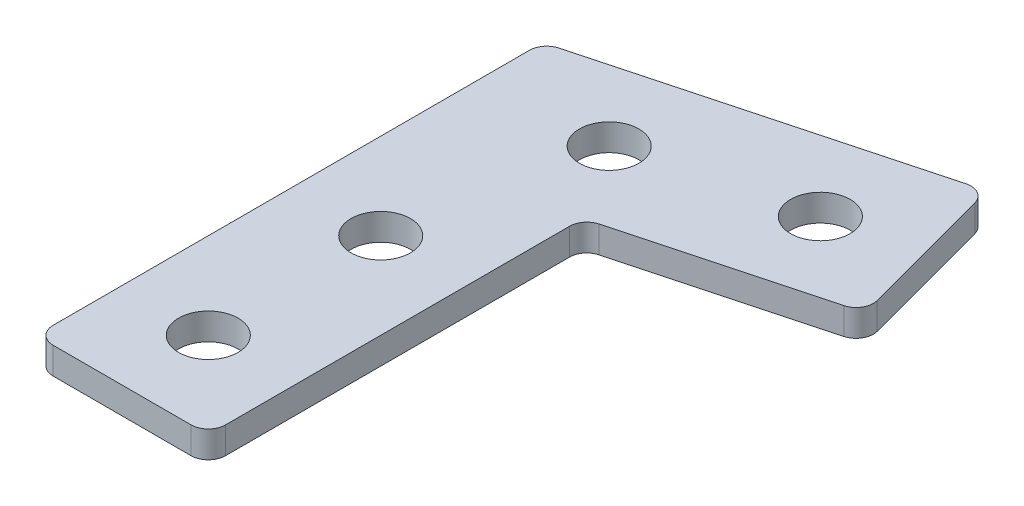
ISO-10303-21;
HEADER;
FILE_DESCRIPTION(('STEP AP214'),'2;1');
FILE_NAME('part.step','',(''),(''),'','','');
FILE_SCHEMA(('AUTOMOTIVE_DESIGN { 1 0 10303 214 1 1 1 1 }'));
ENDSEC;
DATA;
#1=APPLICATION_CONTEXT('core data for automotive mechanical design processes');
#2=APPLICATION_PROTOCOL_DEFINITION('international standard','automotive_design',2000,#1);
#3=PRODUCT_CONTEXT('',#1,'mechanical');
#4=PRODUCT('Part','Part','',(#3));
#5=PRODUCT_RELATED_PRODUCT_CATEGORY('part','',(#4));
#6=PRODUCT_DEFINITION_FORMATION('','',#4);
#7=PRODUCT_DEFINITION_CONTEXT('part definition',#1,'design');
#8=PRODUCT_DEFINITION('design','',#6,#7);
#9=PRODUCT_DEFINITION_SHAPE('','',#8);
#10=(LENGTH_UNIT() NAMED_UNIT(*) SI_UNIT(.MILLI.,.METRE.));
#11=(NAMED_UNIT(*) PLANE_ANGLE_UNIT() SI_UNIT($,.RADIAN.));
#12=(NAMED_UNIT(*) SI_UNIT($,.STERADIAN.) SOLID_ANGLE_UNIT());
#13=UNCERTAINTY_MEASURE_WITH_UNIT(LENGTH_MEASURE(1.E-05),#10,'distance_accuracy_value','');
#14=(GEOMETRIC_REPRESENTATION_CONTEXT(3) GLOBAL_UNCERTAINTY_ASSIGNED_CONTEXT((#13)) GLOBAL_UNIT_ASSIGNED_CONTEXT((#10,
#11,#12)) REPRESENTATION_CONTEXT('',''));
#15=CARTESIAN_POINT('',(0.,0.,0.));
#16=DIRECTION('',(0.,0.,1.));
#17=DIRECTION('',(1.,0.,0.));
#18=AXIS2_PLACEMENT_3D('',#15,#16,#17);
#19=CARTESIAN_POINT('',(0.,1.55,10.));
#20=DIRECTION('',(0.,0.,-1.));
#21=DIRECTION('',(-1.,0.,0.));
#22=AXIS2_PLACEMENT_3D('',#19,#20,#21);
#23=PLANE('',#22);
#24=DIRECTION('',(1.,0.,0.));
#25=VECTOR('',#24,1.);
#26=CARTESIAN_POINT('',(0.,0.,10.));
#27=LINE('',#26,#25);
#28=CARTESIAN_POINT('',(-4.,0.,10.));
#29=VERTEX_POINT('',#28);
#30=CARTESIAN_POINT('',(4.00000000000001,0.,10.));
#31=VERTEX_POINT('',#30);
#32=EDGE_CURVE('E264',#29,#31,#27,.T.);
#33=ORIENTED_EDGE('',*,*,#32,.T.);
#34=DIRECTION('',(0.,-1.,0.));
#35=VECTOR('',#34,1.);
#36=CARTESIAN_POINT('',(4.00000000000001,1.55,10.));
#37=LINE('',#36,#35);
#38=CARTESIAN_POINT('',(4.00000000000001,1.55,10.));
#39=VERTEX_POINT('',#38);
#40=EDGE_CURVE('E246',#31,#39,#37,.F.);
#41=ORIENTED_EDGE('',*,*,#40,.T.);
#42=DIRECTION('',(1.,0.,0.));
#43=VECTOR('',#42,1.);
#44=CARTESIAN_POINT('',(0.,1.55,10.));
#45=LINE('',#44,#43);
#46=CARTESIAN_POINT('',(-4.,1.55,10.));
#47=VERTEX_POINT('',#46);
#48=EDGE_CURVE('E189',#47,#39,#45,.T.);
#49=ORIENTED_EDGE('',*,*,#48,.F.);
#50=DIRECTION('',(0.,-1.,0.));
#51=VECTOR('',#50,1.);
#52=CARTESIAN_POINT('',(-4.,1.55,10.));
#53=LINE('',#52,#51);
#54=EDGE_CURVE('E242',#47,#29,#53,.T.);
#55=ORIENTED_EDGE('',*,*,#54,.T.);
#56=EDGE_LOOP('',(#33,#41,#49,#55));
#57=FACE_BOUND('',#56,.T.);
#58=ADVANCED_FACE('F45',(#57),#23,.F.);
#59=CARTESIAN_POINT('',(5.00000000000001,1.55,0.));
#60=DIRECTION('',(-1.,0.,0.));
#61=DIRECTION('',(0.,0.,1.));
#62=AXIS2_PLACEMENT_3D('',#59,#60,#61);
#63=PLANE('',#62);
#64=DIRECTION('',(0.,0.,-1.));
#65=VECTOR('',#64,1.);
#66=CARTESIAN_POINT('',(5.00000000000001,0.,0.));
#67=LINE('',#66,#65);
#68=CARTESIAN_POINT('',(5.00000000000001,0.,9.));
#69=VERTEX_POINT('',#68);
#70=CARTESIAN_POINT('',(5.,0.,-10.950712202691));
#71=VERTEX_POINT('',#70);
#72=EDGE_CURVE('E252',#69,#71,#67,.T.);
#73=ORIENTED_EDGE('',*,*,#72,.T.);
#74=DIRECTION('',(0.,-1.,0.));
#75=VECTOR('',#74,1.);
#76=CARTESIAN_POINT('',(5.,1.55,-10.950712202691));
#77=LINE('',#76,#75);
#78=CARTESIAN_POINT('',(5.,1.55,-10.950712202691));
#79=VERTEX_POINT('',#78);
#80=EDGE_CURVE('E239',#71,#79,#77,.F.);
#81=ORIENTED_EDGE('',*,*,#80,.T.);
#82=DIRECTION('',(0.,0.,-1.));
#83=VECTOR('',#82,1.);
#84=CARTESIAN_POINT('',(5.00000000000001,1.55,0.));
#85=LINE('',#84,#83);
#86=CARTESIAN_POINT('',(5.00000000000001,1.55,9.));
#87=VERTEX_POINT('',#86);
#88=EDGE_CURVE('E273',#87,#79,#85,.T.);
#89=ORIENTED_EDGE('',*,*,#88,.F.);
#90=DIRECTION('',(0.,-1.,0.));
#91=VECTOR('',#90,1.);
#92=CARTESIAN_POINT('',(5.00000000000001,1.55,9.));
#93=LINE('',#92,#91);
#94=EDGE_CURVE('E235',#87,#69,#93,.T.);
#95=ORIENTED_EDGE('',*,*,#94,.T.);
#96=EDGE_LOOP('',(#73,#81,#89,#95));
#97=FACE_BOUND('',#96,.T.);
#98=ADVANCED_FACE('F259',(#97),#63,.F.);
#99=CARTESIAN_POINT('',(-2.59457330712856,1.55,-9.68307940616591));
#100=DIRECTION('',(0.258819045102518,0.,0.965925826289069));
#101=DIRECTION('',(0.965925826289069,0.,-0.258819045102518));
#102=AXIS2_PLACEMENT_3D('',#99,#100,#101);
#103=PLANE('',#102);
#104=DIRECTION('',(-0.965925826289069,0.,0.258819045102518));
#105=VECTOR('',#104,1.);
#106=CARTESIAN_POINT('',(-2.59457330712856,0.,-9.68307940616591));
#107=LINE('',#106,#105);
#108=CARTESIAN_POINT('',(16.9407811505175,0.,-14.9175618569478));
#109=VERTEX_POINT('',#108);
#110=CARTESIAN_POINT('',(5.74118095489748,0.,-11.91663802898));
#111=VERTEX_POINT('',#110);
#112=EDGE_CURVE('E254',#109,#111,#107,.T.);
#113=ORIENTED_EDGE('',*,*,#112,.F.);
#114=DIRECTION('',(0.,-1.,0.));
#115=VECTOR('',#114,1.);
#116=CARTESIAN_POINT('',(16.9407811505175,1.55,-14.9175618569478));
#117=LINE('',#116,#115);
#118=CARTESIAN_POINT('',(16.9407811505175,1.55,-14.9175618569478));
#119=VERTEX_POINT('',#118);
#120=EDGE_CURVE('E232',#109,#119,#117,.F.);
#121=ORIENTED_EDGE('',*,*,#120,.T.);
#122=DIRECTION('',(-0.965925826289069,0.,0.258819045102518));
#123=VECTOR('',#122,1.);
#124=CARTESIAN_POINT('',(-2.59457330712856,1.55,-9.68307940616591));
#125=LINE('',#124,#123);
#126=CARTESIAN_POINT('',(5.74118095489748,1.55,-11.91663802898));
#127=VERTEX_POINT('',#126);
#128=EDGE_CURVE('E272',#119,#127,#125,.T.);
#129=ORIENTED_EDGE('',*,*,#128,.T.);
#130=DIRECTION('',(0.,-1.,0.));
#131=VECTOR('',#130,1.);
#132=CARTESIAN_POINT('',(5.74118095489748,1.55,-11.91663802898));
#133=LINE('',#132,#131);
#134=EDGE_CURVE('E228',#127,#111,#133,.T.);
#135=ORIENTED_EDGE('',*,*,#134,.T.);
#136=EDGE_LOOP('',(#113,#121,#129,#135));
#137=FACE_BOUND('',#136,.T.);
#138=ADVANCED_FACE('F275',(#137),#103,.T.);
#139=CARTESIAN_POINT('',(20.5012802839351,1.55,-5.49330149588448));
#140=DIRECTION('',(0.965925826289069,0.,-0.258819045102519));
#141=DIRECTION('',(-0.258819045102519,0.,-0.965925826289069));
#142=AXIS2_PLACEMENT_3D('',#139,#140,#141);
#143=PLANE('',#142);
#144=DIRECTION('',(0.258819045102519,0.,0.965925826289069));
#145=VECTOR('',#144,1.);
#146=CARTESIAN_POINT('',(20.5012802839351,0.,-5.49330149588448));
#147=LINE('',#146,#145);
#148=CARTESIAN_POINT('',(15.5773355708839,0.,-23.869713338652));
#149=VERTEX_POINT('',#148);
#150=CARTESIAN_POINT('',(17.6478879317041,0.,-16.1423067283394));
#151=VERTEX_POINT('',#150);
#152=EDGE_CURVE('E174',#149,#151,#147,.T.);
#153=ORIENTED_EDGE('',*,*,#152,.F.);
#154=DIRECTION('',(0.,-1.,0.));
#155=VECTOR('',#154,1.);
#156=CARTESIAN_POINT('',(15.5773355708839,1.55,-23.869713338652));
#157=LINE('',#156,#155);
#158=CARTESIAN_POINT('',(15.5773355708839,1.55,-23.869713338652));
#159=VERTEX_POINT('',#158);
#160=EDGE_CURVE('E68',#149,#159,#157,.F.);
#161=ORIENTED_EDGE('',*,*,#160,.T.);
#162=DIRECTION('',(0.258819045102519,0.,0.965925826289069));
#163=VECTOR('',#162,1.);
#164=CARTESIAN_POINT('',(20.5012802839351,1.55,-5.49330149588448));
#165=LINE('',#164,#163);
#166=CARTESIAN_POINT('',(17.6478879317041,1.55,-16.1423067283394));
#167=VERTEX_POINT('',#166);
#168=EDGE_CURVE('E278',#159,#167,#165,.T.);
#169=ORIENTED_EDGE('',*,*,#168,.T.);
#170=DIRECTION('',(0.,-1.,0.));
#171=VECTOR('',#170,1.);
#172=CARTESIAN_POINT('',(17.6478879317041,1.55,-16.1423067283394));
#173=LINE('',#172,#171);
#174=EDGE_CURVE('E222',#167,#151,#173,.T.);
#175=ORIENTED_EDGE('',*,*,#174,.T.);
#176=EDGE_LOOP('',(#153,#161,#169,#175));
#177=FACE_BOUND('',#176,.T.);
#178=ADVANCED_FACE('F312',(#177),#143,.T.);
#179=CARTESIAN_POINT('',(-5.18276375815374,1.55,-19.3423376690566));
#180=DIRECTION('',(0.258819045102518,0.,0.965925826289069));
#181=DIRECTION('',(0.965925826289069,0.,-0.258819045102518));
#182=AXIS2_PLACEMENT_3D('',#179,#180,#181);
#183=PLANE('',#182);
#184=DIRECTION('',(-0.965925826289069,0.,0.258819045102518));
#185=VECTOR('',#184,1.);
#186=CARTESIAN_POINT('',(-5.18276375815374,0.,-19.3423376690566));
#187=LINE('',#186,#185);
#188=CARTESIAN_POINT('',(14.3525906994923,0.,-24.5768201198385));
#189=VERTEX_POINT('',#188);
#190=CARTESIAN_POINT('',(-4.25881904510252,0.,-19.5899079087697));
#191=VERTEX_POINT('',#190);
#192=EDGE_CURVE('E167',#189,#191,#187,.T.);
#193=ORIENTED_EDGE('',*,*,#192,.T.);
#194=DIRECTION('',(0.,-1.,0.));
#195=VECTOR('',#194,1.);
#196=CARTESIAN_POINT('',(-4.25881904510252,1.55,-19.5899079087697));
#197=LINE('',#196,#195);
#198=CARTESIAN_POINT('',(-4.25881904510252,1.55,-19.5899079087697));
#199=VERTEX_POINT('',#198);
#200=EDGE_CURVE('E141',#191,#199,#197,.F.);
#201=ORIENTED_EDGE('',*,*,#200,.T.);
#202=DIRECTION('',(-0.965925826289069,0.,0.258819045102518));
#203=VECTOR('',#202,1.);
#204=CARTESIAN_POINT('',(-5.18276375815374,1.55,-19.3423376690566));
#205=LINE('',#204,#203);
#206=CARTESIAN_POINT('',(14.3525906994923,1.55,-24.5768201198385));
#207=VERTEX_POINT('',#206);
#208=EDGE_CURVE('E282',#207,#199,#205,.T.);
#209=ORIENTED_EDGE('',*,*,#208,.F.);
#210=DIRECTION('',(0.,-1.,0.));
#211=VECTOR('',#210,1.);
#212=CARTESIAN_POINT('',(14.3525906994923,0.,-24.5768201198385));
#213=LINE('',#212,#211);
#214=EDGE_CURVE('E147',#207,#189,#213,.T.);
#215=ORIENTED_EDGE('',*,*,#214,.T.);
#216=EDGE_LOOP('',(#193,#201,#209,#215));
#217=FACE_BOUND('',#216,.T.);
#218=ADVANCED_FACE('F320',(#217),#183,.F.);
#219=CARTESIAN_POINT('',(0.,1.55,-5.));
#220=DIRECTION('',(0.,-1.,0.));
#221=DIRECTION('',(0.,0.,-1.));
#222=AXIS2_PLACEMENT_3D('',#219,#220,#221);
#223=CYLINDRICAL_SURFACE('',#222,1.725);
#224=CARTESIAN_POINT('',(0.,1.55,-5.));
#225=DIRECTION('',(0.,1.,0.));
#226=DIRECTION('',(0.,0.,1.));
#227=AXIS2_PLACEMENT_3D('',#224,#225,#226);
#228=CIRCLE('',#227,1.725);
#229=CARTESIAN_POINT('',(0.,1.55,-6.725));
#230=VERTEX_POINT('',#229);
#231=EDGE_CURVE('E299',#230,#230,#228,.T.);
#232=CARTESIAN_POINT('',(0.,0.,-5.));
#233=DIRECTION('',(0.,1.,0.));
#234=DIRECTION('',(0.,0.,1.));
#235=AXIS2_PLACEMENT_3D('',#232,#233,#234);
#236=CIRCLE('',#235,1.725);
#237=CARTESIAN_POINT('',(0.,0.,-6.725));
#238=VERTEX_POINT('',#237);
#239=EDGE_CURVE('E181',#238,#238,#236,.T.);
#240=CARTESIAN_POINT('',(0.,1.55,-6.725));
#241=CARTESIAN_POINT('',(0.,1.53385416666667,-6.725));
#242=CARTESIAN_POINT('',(0.,1.51770833333333,-6.725));
#243=CARTESIAN_POINT('',(0.,1.48541666666667,-6.725));
#244=CARTESIAN_POINT('',(0.,1.46927083333333,-6.725));
#245=CARTESIAN_POINT('',(0.,1.43697916666667,-6.725));
#246=CARTESIAN_POINT('',(0.,1.42083333333333,-6.725));
#247=CARTESIAN_POINT('',(0.,1.38854166666667,-6.725));
#248=CARTESIAN_POINT('',(0.,1.37239583333333,-6.725));
#249=CARTESIAN_POINT('',(0.,1.34010416666667,-6.725));
#250=CARTESIAN_POINT('',(0.,1.32395833333333,-6.725));
#251=CARTESIAN_POINT('',(0.,1.29166666666667,-6.725));
#252=CARTESIAN_POINT('',(0.,1.27552083333333,-6.725));
#253=CARTESIAN_POINT('',(0.,1.24322916666667,-6.725));
#254=CARTESIAN_POINT('',(0.,1.22708333333333,-6.725));
#255=CARTESIAN_POINT('',(0.,1.19479166666667,-6.725));
#256=CARTESIAN_POINT('',(0.,1.17864583333333,-6.725));
#257=CARTESIAN_POINT('',(0.,1.14635416666667,-6.725));
#258=CARTESIAN_POINT('',(0.,1.13020833333333,-6.725));
#259=CARTESIAN_POINT('',(0.,1.09791666666667,-6.725));
#260=CARTESIAN_POINT('',(0.,1.08177083333333,-6.725));
#261=CARTESIAN_POINT('',(0.,1.04947916666667,-6.725));
#262=CARTESIAN_POINT('',(0.,1.03333333333333,-6.725));
#263=CARTESIAN_POINT('',(0.,1.00104166666667,-6.725));
#264=CARTESIAN_POINT('',(0.,0.984895833333333,-6.725));
#265=CARTESIAN_POINT('',(0.,0.952604166666667,-6.725));
#266=CARTESIAN_POINT('',(0.,0.936458333333333,-6.725));
#267=CARTESIAN_POINT('',(0.,0.904166666666667,-6.725));
#268=CARTESIAN_POINT('',(0.,0.888020833333333,-6.725));
#269=CARTESIAN_POINT('',(0.,0.855729166666667,-6.725));
#270=CARTESIAN_POINT('',(0.,0.839583333333333,-6.725));
#271=CARTESIAN_POINT('',(0.,0.807291666666667,-6.725));
#272=CARTESIAN_POINT('',(0.,0.791145833333333,-6.725));
#273=CARTESIAN_POINT('',(0.,0.758854166666667,-6.725));
#274=CARTESIAN_POINT('',(0.,0.742708333333333,-6.725));
#275=CARTESIAN_POINT('',(0.,0.710416666666667,-6.725));
#276=CARTESIAN_POINT('',(0.,0.694270833333333,-6.725));
#277=CARTESIAN_POINT('',(0.,0.661979166666667,-6.725));
#278=CARTESIAN_POINT('',(0.,0.645833333333333,-6.725));
#279=CARTESIAN_POINT('',(0.,0.613541666666667,-6.725));
#280=CARTESIAN_POINT('',(0.,0.597395833333333,-6.725));
#281=CARTESIAN_POINT('',(0.,0.565104166666667,-6.725));
#282=CARTESIAN_POINT('',(0.,0.548958333333333,-6.725));
#283=CARTESIAN_POINT('',(0.,0.516666666666667,-6.725));
#284=CARTESIAN_POINT('',(0.,0.500520833333333,-6.725));
#285=CARTESIAN_POINT('',(0.,0.468229166666667,-6.725));
#286=CARTESIAN_POINT('',(0.,0.452083333333333,-6.725));
#287=CARTESIAN_POINT('',(0.,0.419791666666667,-6.725));
#288=CARTESIAN_POINT('',(0.,0.403645833333333,-6.725));
#289=CARTESIAN_POINT('',(0.,0.371354166666667,-6.725));
#290=CARTESIAN_POINT('',(0.,0.355208333333333,-6.725));
#291=CARTESIAN_POINT('',(0.,0.322916666666667,-6.725));
#292=CARTESIAN_POINT('',(0.,0.306770833333333,-6.725));
#293=CARTESIAN_POINT('',(0.,0.274479166666667,-6.725));
#294=CARTESIAN_POINT('',(0.,0.258333333333333,-6.725));
#295=CARTESIAN_POINT('',(0.,0.226041666666667,-6.725));
#296=CARTESIAN_POINT('',(0.,0.209895833333333,-6.725));
#297=CARTESIAN_POINT('',(0.,0.177604166666667,-6.725));
#298=CARTESIAN_POINT('',(0.,0.161458333333333,-6.725));
#299=CARTESIAN_POINT('',(0.,0.129166666666667,-6.725));
#300=CARTESIAN_POINT('',(0.,0.113020833333333,-6.725));
#301=CARTESIAN_POINT('',(0.,0.0807291666666667,-6.725));
#302=CARTESIAN_POINT('',(0.,0.0645833333333334,-6.725));
#303=CARTESIAN_POINT('',(0.,0.0322916666666667,-6.725));
#304=CARTESIAN_POINT('',(0.,0.0161458333333334,-6.725));
#305=CARTESIAN_POINT('',(0.,0.,-6.725));
#306=B_SPLINE_CURVE_WITH_KNOTS('',3,(#240,#241,#242,#243,#244,#245,#246,#247,#248,#249,#250,
#251,#252,#253,#254,#255,#256,#257,#258,#259,#260,#261,#262,#263,#264,#265,#266,#267,#268,#269,
#270,#271,#272,#273,#274,#275,#276,#277,#278,#279,#280,#281,#282,#283,#284,#285,#286,#287,#288,
#289,#290,#291,#292,#293,#294,#295,#296,#297,#298,#299,#300,#301,#302,#303,#304,#305),
.UNSPECIFIED.,.F.,.F.,(4,2,2,2,2,2,2,2,2,2,2,2,2,2,2,2,2,2,2,2,2,2,2,2,2,2,2,2,2,2,2,2,4),(0.,
0.0484375000000001,0.0968750000000002,0.1453125,0.19375,0.2421875,0.290625,0.3390625,0.3875,
0.4359375,0.484375,0.5328125,0.58125,0.6296875,0.678125,0.7265625,0.775,0.8234375,0.871875,
0.9203125,0.96875,1.0171875,1.065625,1.1140625,1.1625,1.2109375,1.259375,1.3078125,1.35625,
1.4046875,1.453125,1.5015625,1.55),.UNSPECIFIED.);
#307=EDGE_CURVE('BSEAM322',#230,#238,#306,.T.);
#308=ORIENTED_EDGE('',*,*,#231,.T.);
#309=ORIENTED_EDGE('',*,*,#239,.F.);
#310=ORIENTED_EDGE('',*,*,#307,.T.);
#311=ORIENTED_EDGE('',*,*,#307,.F.);
#312=EDGE_LOOP('',(#308,#310,#309,#311));
#313=FACE_BOUND('',#312,.T.);
#314=ADVANCED_FACE('F322',(#313),#223,.F.);
#315=CARTESIAN_POINT('',(2.12372435695794,1.55,-16.1237243569579));
#316=DIRECTION('',(0.,-1.,0.));
#317=DIRECTION('',(0.,0.,-1.));
#318=AXIS2_PLACEMENT_3D('',#315,#316,#317);
#319=CYLINDRICAL_SURFACE('',#318,1.725);
#320=CARTESIAN_POINT('',(2.12372435695794,1.55,-16.1237243569579));
#321=DIRECTION('',(0.,1.,0.));
#322=DIRECTION('',(0.,0.,1.));
#323=AXIS2_PLACEMENT_3D('',#320,#321,#322);
#324=CIRCLE('',#323,1.725);
#325=CARTESIAN_POINT('',(2.12372435695794,1.55,-17.8487243569579));
#326=VERTEX_POINT('',#325);
#327=EDGE_CURVE('E295',#326,#326,#324,.T.);
#328=CARTESIAN_POINT('',(2.12372435695794,0.,-16.1237243569579));
#329=DIRECTION('',(0.,1.,0.));
#330=DIRECTION('',(0.,0.,1.));
#331=AXIS2_PLACEMENT_3D('',#328,#329,#330);
#332=CIRCLE('',#331,1.725);
#333=CARTESIAN_POINT('',(2.12372435695794,0.,-17.8487243569579));
#334=VERTEX_POINT('',#333);
#335=EDGE_CURVE('E172',#334,#334,#332,.T.);
#336=CARTESIAN_POINT('',(2.12372435695794,1.55,-17.8487243569579));
#337=CARTESIAN_POINT('',(2.12372435695794,1.53385416666667,-17.8487243569579));
#338=CARTESIAN_POINT('',(2.12372435695794,1.51770833333333,-17.8487243569579));
#339=CARTESIAN_POINT('',(2.12372435695794,1.48541666666667,-17.8487243569579));
#340=CARTESIAN_POINT('',(2.12372435695794,1.46927083333333,-17.8487243569579));
#341=CARTESIAN_POINT('',(2.12372435695794,1.43697916666667,-17.8487243569579));
#342=CARTESIAN_POINT('',(2.12372435695794,1.42083333333333,-17.8487243569579));
#343=CARTESIAN_POINT('',(2.12372435695794,1.38854166666667,-17.8487243569579));
#344=CARTESIAN_POINT('',(2.12372435695794,1.37239583333333,-17.8487243569579));
#345=CARTESIAN_POINT('',(2.12372435695794,1.34010416666667,-17.8487243569579));
#346=CARTESIAN_POINT('',(2.12372435695794,1.32395833333333,-17.8487243569579));
#347=CARTESIAN_POINT('',(2.12372435695794,1.29166666666667,-17.8487243569579));
#348=CARTESIAN_POINT('',(2.12372435695794,1.27552083333333,-17.8487243569579));
#349=CARTESIAN_POINT('',(2.12372435695794,1.24322916666667,-17.8487243569579));
#350=CARTESIAN_POINT('',(2.12372435695794,1.22708333333333,-17.8487243569579));
#351=CARTESIAN_POINT('',(2.12372435695794,1.19479166666667,-17.8487243569579));
#352=CARTESIAN_POINT('',(2.12372435695794,1.17864583333333,-17.8487243569579));
#353=CARTESIAN_POINT('',(2.12372435695794,1.14635416666667,-17.8487243569579));
#354=CARTESIAN_POINT('',(2.12372435695794,1.13020833333333,-17.8487243569579));
#355=CARTESIAN_POINT('',(2.12372435695794,1.09791666666667,-17.8487243569579));
#356=CARTESIAN_POINT('',(2.12372435695794,1.08177083333333,-17.8487243569579));
#357=CARTESIAN_POINT('',(2.12372435695794,1.04947916666667,-17.8487243569579));
#358=CARTESIAN_POINT('',(2.12372435695794,1.03333333333333,-17.8487243569579));
#359=CARTESIAN_POINT('',(2.12372435695794,1.00104166666667,-17.8487243569579));
#360=CARTESIAN_POINT('',(2.12372435695794,0.984895833333333,-17.8487243569579));
#361=CARTESIAN_POINT('',(2.12372435695794,0.952604166666667,-17.8487243569579));
#362=CARTESIAN_POINT('',(2.12372435695794,0.936458333333333,-17.8487243569579));
#363=CARTESIAN_POINT('',(2.12372435695794,0.904166666666667,-17.8487243569579));
#364=CARTESIAN_POINT('',(2.12372435695794,0.888020833333333,-17.8487243569579));
#365=CARTESIAN_POINT('',(2.12372435695794,0.855729166666667,-17.8487243569579));
#366=CARTESIAN_POINT('',(2.12372435695794,0.839583333333333,-17.8487243569579));
#367=CARTESIAN_POINT('',(2.12372435695794,0.807291666666667,-17.8487243569579));
#368=CARTESIAN_POINT('',(2.12372435695794,0.791145833333333,-17.8487243569579));
#369=CARTESIAN_POINT('',(2.12372435695794,0.758854166666667,-17.8487243569579));
#370=CARTESIAN_POINT('',(2.12372435695794,0.742708333333333,-17.8487243569579));
#371=CARTESIAN_POINT('',(2.12372435695794,0.710416666666667,-17.8487243569579));
#372=CARTESIAN_POINT('',(2.12372435695794,0.694270833333333,-17.8487243569579));
#373=CARTESIAN_POINT('',(2.12372435695794,0.661979166666667,-17.8487243569579));
#374=CARTESIAN_POINT('',(2.12372435695794,0.645833333333333,-17.8487243569579));
#375=CARTESIAN_POINT('',(2.12372435695794,0.613541666666667,-17.8487243569579));
#376=CARTESIAN_POINT('',(2.12372435695794,0.597395833333333,-17.8487243569579));
#377=CARTESIAN_POINT('',(2.12372435695794,0.565104166666667,-17.8487243569579));
#378=CARTESIAN_POINT('',(2.12372435695794,0.548958333333333,-17.8487243569579));
#379=CARTESIAN_POINT('',(2.12372435695794,0.516666666666667,-17.8487243569579));
#380=CARTESIAN_POINT('',(2.12372435695794,0.500520833333333,-17.8487243569579));
#381=CARTESIAN_POINT('',(2.12372435695794,0.468229166666667,-17.8487243569579));
#382=CARTESIAN_POINT('',(2.12372435695794,0.452083333333333,-17.8487243569579));
#383=CARTESIAN_POINT('',(2.12372435695794,0.419791666666667,-17.8487243569579));
#384=CARTESIAN_POINT('',(2.12372435695794,0.403645833333333,-17.8487243569579));
#385=CARTESIAN_POINT('',(2.12372435695794,0.371354166666667,-17.8487243569579));
#386=CARTESIAN_POINT('',(2.12372435695794,0.355208333333333,-17.8487243569579));
#387=CARTESIAN_POINT('',(2.12372435695794,0.322916666666667,-17.8487243569579));
#388=CARTESIAN_POINT('',(2.12372435695794,0.306770833333333,-17.8487243569579));
#389=CARTESIAN_POINT('',(2.12372435695794,0.274479166666667,-17.8487243569579));
#390=CARTESIAN_POINT('',(2.12372435695794,0.258333333333333,-17.8487243569579));
#391=CARTESIAN_POINT('',(2.12372435695794,0.226041666666667,-17.8487243569579));
#392=CARTESIAN_POINT('',(2.12372435695794,0.209895833333333,-17.8487243569579));
#393=CARTESIAN_POINT('',(2.12372435695794,0.177604166666667,-17.8487243569579));
#394=CARTESIAN_POINT('',(2.12372435695794,0.161458333333333,-17.8487243569579));
#395=CARTESIAN_POINT('',(2.12372435695794,0.129166666666667,-17.8487243569579));
#396=CARTESIAN_POINT('',(2.12372435695794,0.113020833333333,-17.8487243569579));
#397=CARTESIAN_POINT('',(2.12372435695794,0.0807291666666667,-17.8487243569579));
#398=CARTESIAN_POINT('',(2.12372435695794,0.0645833333333334,-17.8487243569579));
#399=CARTESIAN_POINT('',(2.12372435695794,0.0322916666666667,-17.8487243569579));
#400=CARTESIAN_POINT('',(2.12372435695794,0.0161458333333334,-17.8487243569579));
#401=CARTESIAN_POINT('',(2.12372435695794,0.,-17.8487243569579));
#402=B_SPLINE_CURVE_WITH_KNOTS('',3,(#336,#337,#338,#339,#340,#341,#342,#343,#344,#345,#346,
#347,#348,#349,#350,#351,#352,#353,#354,#355,#356,#357,#358,#359,#360,#361,#362,#363,#364,#365,
#366,#367,#368,#369,#370,#371,#372,#373,#374,#375,#376,#377,#378,#379,#380,#381,#382,#383,#384,
#385,#386,#387,#388,#389,#390,#391,#392,#393,#394,#395,#396,#397,#398,#399,#400,#401),
.UNSPECIFIED.,.F.,.F.,(4,2,2,2,2,2,2,2,2,2,2,2,2,2,2,2,2,2,2,2,2,2,2,2,2,2,2,2,2,2,2,2,4),(0.,
0.0484375000000001,0.0968750000000002,0.1453125,0.19375,0.2421875,0.290625,0.3390625,0.3875,
0.4359375,0.484375,0.5328125,0.58125,0.6296875,0.678125,0.7265625,0.775,0.8234375,0.871875,
0.9203125,0.96875,1.0171875,1.065625,1.1140625,1.1625,1.2109375,1.259375,1.3078125,1.35625,
1.4046875,1.453125,1.5015625,1.55),.UNSPECIFIED.);
#403=EDGE_CURVE('BSEAM328',#326,#334,#402,.T.);
#404=ORIENTED_EDGE('',*,*,#327,.T.);
#405=ORIENTED_EDGE('',*,*,#335,.F.);
#406=ORIENTED_EDGE('',*,*,#403,.T.);
#407=ORIENTED_EDGE('',*,*,#403,.F.);
#408=EDGE_LOOP('',(#404,#406,#405,#407));
#409=FACE_BOUND('',#408,.T.);
#410=ADVANCED_FACE('F328',(#409),#319,.F.);
#411=CARTESIAN_POINT('',(11.7829826198486,1.55,-18.7119148079831));
#412=DIRECTION('',(0.,-1.,0.));
#413=DIRECTION('',(0.,0.,-1.));
#414=AXIS2_PLACEMENT_3D('',#411,#412,#413);
#415=CYLINDRICAL_SURFACE('',#414,1.725);
#416=CARTESIAN_POINT('',(11.7829826198486,1.55,-18.7119148079831));
#417=DIRECTION('',(0.,1.,0.));
#418=DIRECTION('',(0.,0.,1.));
#419=AXIS2_PLACEMENT_3D('',#416,#417,#418);
#420=CIRCLE('',#419,1.725);
#421=CARTESIAN_POINT('',(11.7829826198486,1.55,-20.4369148079831));
#422=VERTEX_POINT('',#421);
#423=EDGE_CURVE('E291',#422,#422,#420,.T.);
#424=CARTESIAN_POINT('',(11.7829826198486,0.,-18.7119148079831));
#425=DIRECTION('',(0.,1.,0.));
#426=DIRECTION('',(0.,0.,1.));
#427=AXIS2_PLACEMENT_3D('',#424,#425,#426);
#428=CIRCLE('',#427,1.725);
#429=CARTESIAN_POINT('',(11.7829826198486,0.,-20.4369148079831));
#430=VERTEX_POINT('',#429);
#431=EDGE_CURVE('E166',#430,#430,#428,.T.);
#432=CARTESIAN_POINT('',(11.7829826198486,1.55,-20.4369148079831));
#433=CARTESIAN_POINT('',(11.7829826198486,1.53385416666667,-20.4369148079831));
#434=CARTESIAN_POINT('',(11.7829826198486,1.51770833333333,-20.4369148079831));
#435=CARTESIAN_POINT('',(11.7829826198486,1.48541666666667,-20.4369148079831));
#436=CARTESIAN_POINT('',(11.7829826198486,1.46927083333333,-20.4369148079831));
#437=CARTESIAN_POINT('',(11.7829826198486,1.43697916666667,-20.4369148079831));
#438=CARTESIAN_POINT('',(11.7829826198486,1.42083333333333,-20.4369148079831));
#439=CARTESIAN_POINT('',(11.7829826198486,1.38854166666667,-20.4369148079831));
#440=CARTESIAN_POINT('',(11.7829826198486,1.37239583333333,-20.4369148079831));
#441=CARTESIAN_POINT('',(11.7829826198486,1.34010416666667,-20.4369148079831));
#442=CARTESIAN_POINT('',(11.7829826198486,1.32395833333333,-20.4369148079831));
#443=CARTESIAN_POINT('',(11.7829826198486,1.29166666666667,-20.4369148079831));
#444=CARTESIAN_POINT('',(11.7829826198486,1.27552083333333,-20.4369148079831));
#445=CARTESIAN_POINT('',(11.7829826198486,1.24322916666667,-20.4369148079831));
#446=CARTESIAN_POINT('',(11.7829826198486,1.22708333333333,-20.4369148079831));
#447=CARTESIAN_POINT('',(11.7829826198486,1.19479166666667,-20.4369148079831));
#448=CARTESIAN_POINT('',(11.7829826198486,1.17864583333333,-20.4369148079831));
#449=CARTESIAN_POINT('',(11.7829826198486,1.14635416666667,-20.4369148079831));
#450=CARTESIAN_POINT('',(11.7829826198486,1.13020833333333,-20.4369148079831));
#451=CARTESIAN_POINT('',(11.7829826198486,1.09791666666667,-20.4369148079831));
#452=CARTESIAN_POINT('',(11.7829826198486,1.08177083333333,-20.4369148079831));
#453=CARTESIAN_POINT('',(11.7829826198486,1.04947916666667,-20.4369148079831));
#454=CARTESIAN_POINT('',(11.7829826198486,1.03333333333333,-20.4369148079831));
#455=CARTESIAN_POINT('',(11.7829826198486,1.00104166666667,-20.4369148079831));
#456=CARTESIAN_POINT('',(11.7829826198486,0.984895833333333,-20.4369148079831));
#457=CARTESIAN_POINT('',(11.7829826198486,0.952604166666667,-20.4369148079831));
#458=CARTESIAN_POINT('',(11.7829826198486,0.936458333333333,-20.4369148079831));
#459=CARTESIAN_POINT('',(11.7829826198486,0.904166666666667,-20.4369148079831));
#460=CARTESIAN_POINT('',(11.7829826198486,0.888020833333333,-20.4369148079831));
#461=CARTESIAN_POINT('',(11.7829826198486,0.855729166666667,-20.4369148079831));
#462=CARTESIAN_POINT('',(11.7829826198486,0.839583333333333,-20.4369148079831));
#463=CARTESIAN_POINT('',(11.7829826198486,0.807291666666667,-20.4369148079831));
#464=CARTESIAN_POINT('',(11.7829826198486,0.791145833333333,-20.4369148079831));
#465=CARTESIAN_POINT('',(11.7829826198486,0.758854166666667,-20.4369148079831));
#466=CARTESIAN_POINT('',(11.7829826198486,0.742708333333333,-20.4369148079831));
#467=CARTESIAN_POINT('',(11.7829826198486,0.710416666666667,-20.4369148079831));
#468=CARTESIAN_POINT('',(11.7829826198486,0.694270833333333,-20.4369148079831));
#469=CARTESIAN_POINT('',(11.7829826198486,0.661979166666667,-20.4369148079831));
#470=CARTESIAN_POINT('',(11.7829826198486,0.645833333333333,-20.4369148079831));
#471=CARTESIAN_POINT('',(11.7829826198486,0.613541666666667,-20.4369148079831));
#472=CARTESIAN_POINT('',(11.7829826198486,0.597395833333333,-20.4369148079831));
#473=CARTESIAN_POINT('',(11.7829826198486,0.565104166666667,-20.4369148079831));
#474=CARTESIAN_POINT('',(11.7829826198486,0.548958333333333,-20.4369148079831));
#475=CARTESIAN_POINT('',(11.7829826198486,0.516666666666667,-20.4369148079831));
#476=CARTESIAN_POINT('',(11.7829826198486,0.500520833333333,-20.4369148079831));
#477=CARTESIAN_POINT('',(11.7829826198486,0.468229166666667,-20.4369148079831));
#478=CARTESIAN_POINT('',(11.7829826198486,0.452083333333333,-20.4369148079831));
#479=CARTESIAN_POINT('',(11.7829826198486,0.419791666666667,-20.4369148079831));
#480=CARTESIAN_POINT('',(11.7829826198486,0.403645833333333,-20.4369148079831));
#481=CARTESIAN_POINT('',(11.7829826198486,0.371354166666667,-20.4369148079831));
#482=CARTESIAN_POINT('',(11.7829826198486,0.355208333333333,-20.4369148079831));
#483=CARTESIAN_POINT('',(11.7829826198486,0.322916666666667,-20.4369148079831));
#484=CARTESIAN_POINT('',(11.7829826198486,0.306770833333333,-20.4369148079831));
#485=CARTESIAN_POINT('',(11.7829826198486,0.274479166666667,-20.4369148079831));
#486=CARTESIAN_POINT('',(11.7829826198486,0.258333333333333,-20.4369148079831));
#487=CARTESIAN_POINT('',(11.7829826198486,0.226041666666667,-20.4369148079831));
#488=CARTESIAN_POINT('',(11.7829826198486,0.209895833333333,-20.4369148079831));
#489=CARTESIAN_POINT('',(11.7829826198486,0.177604166666667,-20.4369148079831));
#490=CARTESIAN_POINT('',(11.7829826198486,0.161458333333333,-20.4369148079831));
#491=CARTESIAN_POINT('',(11.7829826198486,0.129166666666667,-20.4369148079831));
#492=CARTESIAN_POINT('',(11.7829826198486,0.113020833333333,-20.4369148079831));
#493=CARTESIAN_POINT('',(11.7829826198486,0.0807291666666667,-20.4369148079831));
#494=CARTESIAN_POINT('',(11.7829826198486,0.0645833333333334,-20.4369148079831));
#495=CARTESIAN_POINT('',(11.7829826198486,0.0322916666666667,-20.4369148079831));
#496=CARTESIAN_POINT('',(11.7829826198486,0.0161458333333334,-20.4369148079831));
#497=CARTESIAN_POINT('',(11.7829826198486,0.,-20.4369148079831));
#498=B_SPLINE_CURVE_WITH_KNOTS('',3,(#432,#433,#434,#435,#436,#437,#438,#439,#440,#441,#442,
#443,#444,#445,#446,#447,#448,#449,#450,#451,#452,#453,#454,#455,#456,#457,#458,#459,#460,#461,
#462,#463,#464,#465,#466,#467,#468,#469,#470,#471,#472,#473,#474,#475,#476,#477,#478,#479,#480,
#481,#482,#483,#484,#485,#486,#487,#488,#489,#490,#491,#492,#493,#494,#495,#496,#497),
.UNSPECIFIED.,.F.,.F.,(4,2,2,2,2,2,2,2,2,2,2,2,2,2,2,2,2,2,2,2,2,2,2,2,2,2,2,2,2,2,2,2,4),(0.,
0.0484375000000001,0.0968750000000002,0.1453125,0.19375,0.2421875,0.290625,0.3390625,0.3875,
0.4359375,0.484375,0.5328125,0.58125,0.6296875,0.678125,0.7265625,0.775,0.8234375,0.871875,
0.9203125,0.96875,1.0171875,1.065625,1.1140625,1.1625,1.2109375,1.259375,1.3078125,1.35625,
1.4046875,1.453125,1.5015625,1.55),.UNSPECIFIED.);
#499=EDGE_CURVE('BSEAM430',#422,#430,#498,.T.);
#500=ORIENTED_EDGE('',*,*,#423,.T.);
#501=ORIENTED_EDGE('',*,*,#431,.F.);
#502=ORIENTED_EDGE('',*,*,#499,.T.);
#503=ORIENTED_EDGE('',*,*,#499,.F.);
#504=EDGE_LOOP('',(#500,#502,#501,#503));
#505=FACE_BOUND('',#504,.T.);
#506=ADVANCED_FACE('F430',(#505),#415,.F.);
#507=CARTESIAN_POINT('',(-5.,1.55,0.));
#508=DIRECTION('',(1.,0.,0.));
#509=DIRECTION('',(0.,0.,-1.));
#510=AXIS2_PLACEMENT_3D('',#507,#508,#509);
#511=PLANE('',#510);
#512=DIRECTION('',(0.,0.,1.));
#513=VECTOR('',#512,1.);
#514=CARTESIAN_POINT('',(-5.,1.55,0.));
#515=LINE('',#514,#513);
#516=CARTESIAN_POINT('',(-5.,1.55,-18.6239820824806));
#517=VERTEX_POINT('',#516);
#518=CARTESIAN_POINT('',(-5.,1.55,9.));
#519=VERTEX_POINT('',#518);
#520=EDGE_CURVE('E157',#517,#519,#515,.T.);
#521=ORIENTED_EDGE('',*,*,#520,.F.);
#522=DIRECTION('',(0.,-1.,0.));
#523=VECTOR('',#522,1.);
#524=CARTESIAN_POINT('',(-5.,1.55,-18.6239820824806));
#525=LINE('',#524,#523);
#526=CARTESIAN_POINT('',(-5.,0.,-18.6239820824806));
#527=VERTEX_POINT('',#526);
#528=EDGE_CURVE('E140',#517,#527,#525,.T.);
#529=ORIENTED_EDGE('',*,*,#528,.T.);
#530=DIRECTION('',(0.,0.,1.));
#531=VECTOR('',#530,1.);
#532=CARTESIAN_POINT('',(-5.,0.,0.));
#533=LINE('',#532,#531);
#534=CARTESIAN_POINT('',(-5.,0.,9.));
#535=VERTEX_POINT('',#534);
#536=EDGE_CURVE('E154',#527,#535,#533,.T.);
#537=ORIENTED_EDGE('',*,*,#536,.T.);
#538=DIRECTION('',(0.,-1.,0.));
#539=VECTOR('',#538,1.);
#540=CARTESIAN_POINT('',(-5.,1.55,9.));
#541=LINE('',#540,#539);
#542=EDGE_CURVE('E160',#535,#519,#541,.F.);
#543=ORIENTED_EDGE('',*,*,#542,.T.);
#544=EDGE_LOOP('',(#521,#529,#537,#543));
#545=FACE_BOUND('',#544,.T.);
#546=ADVANCED_FACE('F153',(#545),#511,.F.);
#547=CARTESIAN_POINT('',(0.,1.55,5.));
#548=DIRECTION('',(0.,-1.,0.));
#549=DIRECTION('',(0.,0.,-1.));
#550=AXIS2_PLACEMENT_3D('',#547,#548,#549);
#551=CYLINDRICAL_SURFACE('',#550,1.725);
#552=CARTESIAN_POINT('',(0.,1.55,5.));
#553=DIRECTION('',(0.,1.,0.));
#554=DIRECTION('',(0.,0.,1.));
#555=AXIS2_PLACEMENT_3D('',#552,#553,#554);
#556=CIRCLE('',#555,1.725);
#557=CARTESIAN_POINT('',(0.,1.55,3.275));
#558=VERTEX_POINT('',#557);
#559=EDGE_CURVE('E191',#558,#558,#556,.T.);
#560=CARTESIAN_POINT('',(0.,0.,5.));
#561=DIRECTION('',(0.,1.,0.));
#562=DIRECTION('',(0.,0.,1.));
#563=AXIS2_PLACEMENT_3D('',#560,#561,#562);
#564=CIRCLE('',#563,1.725);
#565=CARTESIAN_POINT('',(0.,0.,3.275));
#566=VERTEX_POINT('',#565);
#567=EDGE_CURVE('E185',#566,#566,#564,.T.);
#568=CARTESIAN_POINT('',(0.,1.55,3.275));
#569=CARTESIAN_POINT('',(0.,1.53385416666667,3.275));
#570=CARTESIAN_POINT('',(0.,1.51770833333333,3.275));
#571=CARTESIAN_POINT('',(0.,1.48541666666667,3.275));
#572=CARTESIAN_POINT('',(0.,1.46927083333333,3.275));
#573=CARTESIAN_POINT('',(0.,1.43697916666667,3.275));
#574=CARTESIAN_POINT('',(0.,1.42083333333333,3.275));
#575=CARTESIAN_POINT('',(0.,1.38854166666667,3.275));
#576=CARTESIAN_POINT('',(0.,1.37239583333333,3.275));
#577=CARTESIAN_POINT('',(0.,1.34010416666667,3.275));
#578=CARTESIAN_POINT('',(0.,1.32395833333333,3.275));
#579=CARTESIAN_POINT('',(0.,1.29166666666667,3.275));
#580=CARTESIAN_POINT('',(0.,1.27552083333333,3.275));
#581=CARTESIAN_POINT('',(0.,1.24322916666667,3.275));
#582=CARTESIAN_POINT('',(0.,1.22708333333333,3.275));
#583=CARTESIAN_POINT('',(0.,1.19479166666667,3.275));
#584=CARTESIAN_POINT('',(0.,1.17864583333333,3.275));
#585=CARTESIAN_POINT('',(0.,1.14635416666667,3.275));
#586=CARTESIAN_POINT('',(0.,1.13020833333333,3.275));
#587=CARTESIAN_POINT('',(0.,1.09791666666667,3.275));
#588=CARTESIAN_POINT('',(0.,1.08177083333333,3.275));
#589=CARTESIAN_POINT('',(0.,1.04947916666667,3.275));
#590=CARTESIAN_POINT('',(0.,1.03333333333333,3.275));
#591=CARTESIAN_POINT('',(0.,1.00104166666667,3.275));
#592=CARTESIAN_POINT('',(0.,0.984895833333333,3.275));
#593=CARTESIAN_POINT('',(0.,0.952604166666667,3.275));
#594=CARTESIAN_POINT('',(0.,0.936458333333333,3.275));
#595=CARTESIAN_POINT('',(0.,0.904166666666667,3.275));
#596=CARTESIAN_POINT('',(0.,0.888020833333333,3.275));
#597=CARTESIAN_POINT('',(0.,0.855729166666667,3.275));
#598=CARTESIAN_POINT('',(0.,0.839583333333333,3.275));
#599=CARTESIAN_POINT('',(0.,0.807291666666667,3.275));
#600=CARTESIAN_POINT('',(0.,0.791145833333333,3.275));
#601=CARTESIAN_POINT('',(0.,0.758854166666667,3.275));
#602=CARTESIAN_POINT('',(0.,0.742708333333333,3.275));
#603=CARTESIAN_POINT('',(0.,0.710416666666667,3.275));
#604=CARTESIAN_POINT('',(0.,0.694270833333333,3.275));
#605=CARTESIAN_POINT('',(0.,0.661979166666667,3.275));
#606=CARTESIAN_POINT('',(0.,0.645833333333333,3.275));
#607=CARTESIAN_POINT('',(0.,0.613541666666667,3.275));
#608=CARTESIAN_POINT('',(0.,0.597395833333333,3.275));
#609=CARTESIAN_POINT('',(0.,0.565104166666667,3.275));
#610=CARTESIAN_POINT('',(0.,0.548958333333333,3.275));
#611=CARTESIAN_POINT('',(0.,0.516666666666667,3.275));
#612=CARTESIAN_POINT('',(0.,0.500520833333333,3.275));
#613=CARTESIAN_POINT('',(0.,0.468229166666667,3.275));
#614=CARTESIAN_POINT('',(0.,0.452083333333333,3.275));
#615=CARTESIAN_POINT('',(0.,0.419791666666667,3.275));
#616=CARTESIAN_POINT('',(0.,0.403645833333333,3.275));
#617=CARTESIAN_POINT('',(0.,0.371354166666667,3.275));
#618=CARTESIAN_POINT('',(0.,0.355208333333333,3.275));
#619=CARTESIAN_POINT('',(0.,0.322916666666667,3.275));
#620=CARTESIAN_POINT('',(0.,0.306770833333333,3.275));
#621=CARTESIAN_POINT('',(0.,0.274479166666667,3.275));
#622=CARTESIAN_POINT('',(0.,0.258333333333333,3.275));
#623=CARTESIAN_POINT('',(0.,0.226041666666667,3.275));
#624=CARTESIAN_POINT('',(0.,0.209895833333333,3.275));
#625=CARTESIAN_POINT('',(0.,0.177604166666667,3.275));
#626=CARTESIAN_POINT('',(0.,0.161458333333333,3.275));
#627=CARTESIAN_POINT('',(0.,0.129166666666667,3.275));
#628=CARTESIAN_POINT('',(0.,0.113020833333333,3.275));
#629=CARTESIAN_POINT('',(0.,0.0807291666666667,3.275));
#630=CARTESIAN_POINT('',(0.,0.0645833333333334,3.275));
#631=CARTESIAN_POINT('',(0.,0.0322916666666667,3.275));
#632=CARTESIAN_POINT('',(0.,0.0161458333333334,3.275));
#633=CARTESIAN_POINT('',(0.,0.,3.275));
#634=B_SPLINE_CURVE_WITH_KNOTS('',3,(#568,#569,#570,#571,#572,#573,#574,#575,#576,#577,#578,
#579,#580,#581,#582,#583,#584,#585,#586,#587,#588,#589,#590,#591,#592,#593,#594,#595,#596,#597,
#598,#599,#600,#601,#602,#603,#604,#605,#606,#607,#608,#609,#610,#611,#612,#613,#614,#615,#616,
#617,#618,#619,#620,#621,#622,#623,#624,#625,#626,#627,#628,#629,#630,#631,#632,#633),
.UNSPECIFIED.,.F.,.F.,(4,2,2,2,2,2,2,2,2,2,2,2,2,2,2,2,2,2,2,2,2,2,2,2,2,2,2,2,2,2,2,2,4),(0.,
0.0484375000000001,0.0968750000000002,0.1453125,0.19375,0.2421875,0.290625,0.3390625,0.3875,
0.4359375,0.484375,0.5328125,0.58125,0.6296875,0.678125,0.7265625,0.775,0.8234375,0.871875,
0.9203125,0.96875,1.0171875,1.065625,1.1140625,1.1625,1.2109375,1.259375,1.3078125,1.35625,
1.4046875,1.453125,1.5015625,1.55),.UNSPECIFIED.);
#635=EDGE_CURVE('BSEAM419',#558,#566,#634,.T.);
#636=ORIENTED_EDGE('',*,*,#559,.T.);
#637=ORIENTED_EDGE('',*,*,#567,.F.);
#638=ORIENTED_EDGE('',*,*,#635,.T.);
#639=ORIENTED_EDGE('',*,*,#635,.F.);
#640=EDGE_LOOP('',(#636,#638,#637,#639));
#641=FACE_BOUND('',#640,.T.);
#642=ADVANCED_FACE('F419',(#641),#551,.F.);
#643=CARTESIAN_POINT('',(0.,1.55,0.));
#644=DIRECTION('',(0.,1.,0.));
#645=DIRECTION('',(0.,0.,1.));
#646=AXIS2_PLACEMENT_3D('',#643,#644,#645);
#647=PLANE('',#646);
#648=ORIENTED_EDGE('',*,*,#208,.T.);
#649=CARTESIAN_POINT('',(-4.,1.55,-18.6239820824806));
#650=DIRECTION('',(0.,1.,0.));
#651=DIRECTION('',(0.,0.,1.));
#652=AXIS2_PLACEMENT_3D('',#649,#650,#651);
#653=CIRCLE('',#652,1.);
#654=EDGE_CURVE('E219',#199,#517,#653,.T.);
#655=ORIENTED_EDGE('',*,*,#654,.T.);
#656=ORIENTED_EDGE('',*,*,#520,.T.);
#657=CARTESIAN_POINT('',(-4.,1.55,9.));
#658=DIRECTION('',(0.,1.,0.));
#659=DIRECTION('',(0.,0.,1.));
#660=AXIS2_PLACEMENT_3D('',#657,#658,#659);
#661=CIRCLE('',#660,1.);
#662=EDGE_CURVE('E208',#519,#47,#661,.T.);
#663=ORIENTED_EDGE('',*,*,#662,.T.);
#664=ORIENTED_EDGE('',*,*,#48,.T.);
#665=CARTESIAN_POINT('',(4.00000000000001,1.55,9.));
#666=DIRECTION('',(0.,1.,0.));
#667=DIRECTION('',(0.,0.,1.));
#668=AXIS2_PLACEMENT_3D('',#665,#666,#667);
#669=CIRCLE('',#668,1.);
#670=EDGE_CURVE('E211',#39,#87,#669,.T.);
#671=ORIENTED_EDGE('',*,*,#670,.T.);
#672=ORIENTED_EDGE('',*,*,#88,.T.);
#673=CARTESIAN_POINT('',(6.,1.55,-10.950712202691));
#674=DIRECTION('',(0.,1.,0.));
#675=DIRECTION('',(0.,0.,1.));
#676=AXIS2_PLACEMENT_3D('',#673,#674,#675);
#677=CIRCLE('',#676,1.);
#678=EDGE_CURVE('E11',#79,#127,#677,.F.);
#679=ORIENTED_EDGE('',*,*,#678,.T.);
#680=ORIENTED_EDGE('',*,*,#128,.F.);
#681=CARTESIAN_POINT('',(16.681962105415,1.55,-15.8834876832369));
#682=DIRECTION('',(0.,1.,0.));
#683=DIRECTION('',(0.,0.,1.));
#684=AXIS2_PLACEMENT_3D('',#681,#682,#683);
#685=CIRCLE('',#684,1.);
#686=EDGE_CURVE('E61',#119,#167,#685,.T.);
#687=ORIENTED_EDGE('',*,*,#686,.T.);
#688=ORIENTED_EDGE('',*,*,#168,.F.);
#689=CARTESIAN_POINT('',(14.6114097445948,1.55,-23.6108942935495));
#690=DIRECTION('',(0.,1.,0.));
#691=DIRECTION('',(0.,0.,1.));
#692=AXIS2_PLACEMENT_3D('',#689,#690,#691);
#693=CIRCLE('',#692,1.);
#694=EDGE_CURVE('E216',#159,#207,#693,.T.);
#695=ORIENTED_EDGE('',*,*,#694,.T.);
#696=EDGE_LOOP('',(#648,#655,#656,#663,#664,#671,#672,#679,#680,#687,#688,#695));
#697=FACE_BOUND('',#696,.T.);
#698=ORIENTED_EDGE('',*,*,#423,.F.);
#699=EDGE_LOOP('',(#698));
#700=FACE_BOUND('',#699,.T.);
#701=ORIENTED_EDGE('',*,*,#327,.F.);
#702=EDGE_LOOP('',(#701));
#703=FACE_BOUND('',#702,.T.);
#704=ORIENTED_EDGE('',*,*,#231,.F.);
#705=EDGE_LOOP('',(#704));
#706=FACE_BOUND('',#705,.T.);
#707=ORIENTED_EDGE('',*,*,#559,.F.);
#708=EDGE_LOOP('',(#707));
#709=FACE_BOUND('',#708,.T.);
#710=ADVANCED_FACE('F270',(#697,#700,#703,#706,#709),#647,.T.);
#711=CARTESIAN_POINT('',(0.,0.,0.));
#712=DIRECTION('',(0.,1.,0.));
#713=DIRECTION('',(0.,0.,1.));
#714=AXIS2_PLACEMENT_3D('',#711,#712,#713);
#715=PLANE('',#714);
#716=ORIENTED_EDGE('',*,*,#536,.F.);
#717=CARTESIAN_POINT('',(-4.,0.,-18.6239820824806));
#718=DIRECTION('',(0.,1.,0.));
#719=DIRECTION('',(0.,0.,1.));
#720=AXIS2_PLACEMENT_3D('',#717,#718,#719);
#721=CIRCLE('',#720,1.);
#722=EDGE_CURVE('E136',#527,#191,#721,.F.);
#723=ORIENTED_EDGE('',*,*,#722,.T.);
#724=ORIENTED_EDGE('',*,*,#192,.F.);
#725=CARTESIAN_POINT('',(14.6114097445948,0.,-23.6108942935495));
#726=DIRECTION('',(0.,1.,0.));
#727=DIRECTION('',(0.,0.,1.));
#728=AXIS2_PLACEMENT_3D('',#725,#726,#727);
#729=CIRCLE('',#728,1.);
#730=EDGE_CURVE('E148',#189,#149,#729,.F.);
#731=ORIENTED_EDGE('',*,*,#730,.T.);
#732=ORIENTED_EDGE('',*,*,#152,.T.);
#733=CARTESIAN_POINT('',(16.681962105415,0.,-15.8834876832369));
#734=DIRECTION('',(0.,1.,0.));
#735=DIRECTION('',(0.,0.,1.));
#736=AXIS2_PLACEMENT_3D('',#733,#734,#735);
#737=CIRCLE('',#736,1.);
#738=EDGE_CURVE('E198',#151,#109,#737,.F.);
#739=ORIENTED_EDGE('',*,*,#738,.T.);
#740=ORIENTED_EDGE('',*,*,#112,.T.);
#741=CARTESIAN_POINT('',(6.,0.,-10.950712202691));
#742=DIRECTION('',(0.,1.,0.));
#743=DIRECTION('',(0.,0.,1.));
#744=AXIS2_PLACEMENT_3D('',#741,#742,#743);
#745=CIRCLE('',#744,1.);
#746=EDGE_CURVE('E54',#111,#71,#745,.T.);
#747=ORIENTED_EDGE('',*,*,#746,.T.);
#748=ORIENTED_EDGE('',*,*,#72,.F.);
#749=CARTESIAN_POINT('',(4.00000000000001,0.,9.));
#750=DIRECTION('',(0.,1.,0.));
#751=DIRECTION('',(0.,0.,1.));
#752=AXIS2_PLACEMENT_3D('',#749,#750,#751);
#753=CIRCLE('',#752,1.);
#754=EDGE_CURVE('E195',#69,#31,#753,.F.);
#755=ORIENTED_EDGE('',*,*,#754,.T.);
#756=ORIENTED_EDGE('',*,*,#32,.F.);
#757=CARTESIAN_POINT('',(-4.,0.,9.));
#758=DIRECTION('',(0.,1.,0.));
#759=DIRECTION('',(0.,0.,1.));
#760=AXIS2_PLACEMENT_3D('',#757,#758,#759);
#761=CIRCLE('',#760,1.);
#762=EDGE_CURVE('E159',#29,#535,#761,.F.);
#763=ORIENTED_EDGE('',*,*,#762,.T.);
#764=EDGE_LOOP('',(#716,#723,#724,#731,#732,#739,#740,#747,#748,#755,#756,#763));
#765=FACE_BOUND('',#764,.T.);
#766=ORIENTED_EDGE('',*,*,#431,.T.);
#767=EDGE_LOOP('',(#766));
#768=FACE_BOUND('',#767,.T.);
#769=ORIENTED_EDGE('',*,*,#335,.T.);
#770=EDGE_LOOP('',(#769));
#771=FACE_BOUND('',#770,.T.);
#772=ORIENTED_EDGE('',*,*,#239,.T.);
#773=EDGE_LOOP('',(#772));
#774=FACE_BOUND('',#773,.T.);
#775=ORIENTED_EDGE('',*,*,#567,.T.);
#776=EDGE_LOOP('',(#775));
#777=FACE_BOUND('',#776,.T.);
#778=ADVANCED_FACE('F162',(#765,#768,#771,#774,#777),#715,.F.);
#779=CARTESIAN_POINT('',(-4.,1.55,-18.6239820824806));
#780=DIRECTION('',(0.,-1.,0.));
#781=DIRECTION('',(0.,0.,-1.));
#782=AXIS2_PLACEMENT_3D('',#779,#780,#781);
#783=CYLINDRICAL_SURFACE('',#782,1.);
#784=ORIENTED_EDGE('',*,*,#654,.F.);
#785=ORIENTED_EDGE('',*,*,#200,.F.);
#786=ORIENTED_EDGE('',*,*,#722,.F.);
#787=ORIENTED_EDGE('',*,*,#528,.F.);
#788=EDGE_LOOP('',(#784,#785,#786,#787));
#789=FACE_BOUND('',#788,.T.);
#790=ADVANCED_FACE('F139',(#789),#783,.T.);
#791=CARTESIAN_POINT('',(14.6114097445948,1.55,-23.6108942935495));
#792=DIRECTION('',(0.,1.,0.));
#793=DIRECTION('',(0.,0.,1.));
#794=AXIS2_PLACEMENT_3D('',#791,#792,#793);
#795=CYLINDRICAL_SURFACE('',#794,1.);
#796=ORIENTED_EDGE('',*,*,#694,.F.);
#797=ORIENTED_EDGE('',*,*,#160,.F.);
#798=ORIENTED_EDGE('',*,*,#730,.F.);
#799=ORIENTED_EDGE('',*,*,#214,.F.);
#800=EDGE_LOOP('',(#796,#797,#798,#799));
#801=FACE_BOUND('',#800,.T.);
#802=ADVANCED_FACE('F316',(#801),#795,.T.);
#803=CARTESIAN_POINT('',(16.681962105415,1.55,-15.8834876832369));
#804=DIRECTION('',(0.,-1.,0.));
#805=DIRECTION('',(0.,0.,-1.));
#806=AXIS2_PLACEMENT_3D('',#803,#804,#805);
#807=CYLINDRICAL_SURFACE('',#806,1.);
#808=ORIENTED_EDGE('',*,*,#686,.F.);
#809=ORIENTED_EDGE('',*,*,#120,.F.);
#810=ORIENTED_EDGE('',*,*,#738,.F.);
#811=ORIENTED_EDGE('',*,*,#174,.F.);
#812=EDGE_LOOP('',(#808,#809,#810,#811));
#813=FACE_BOUND('',#812,.T.);
#814=ADVANCED_FACE('F346',(#813),#807,.T.);
#815=CARTESIAN_POINT('',(6.,1.55,-10.950712202691));
#816=DIRECTION('',(0.,-1.,0.));
#817=DIRECTION('',(0.,0.,-1.));
#818=AXIS2_PLACEMENT_3D('',#815,#816,#817);
#819=CYLINDRICAL_SURFACE('',#818,1.);
#820=ORIENTED_EDGE('',*,*,#678,.F.);
#821=ORIENTED_EDGE('',*,*,#80,.F.);
#822=ORIENTED_EDGE('',*,*,#746,.F.);
#823=ORIENTED_EDGE('',*,*,#134,.F.);
#824=EDGE_LOOP('',(#820,#821,#822,#823));
#825=FACE_BOUND('',#824,.T.);
#826=ADVANCED_FACE('F267',(#825),#819,.F.);
#827=CARTESIAN_POINT('',(4.00000000000001,1.55,9.));
#828=DIRECTION('',(0.,-1.,0.));
#829=DIRECTION('',(0.,0.,-1.));
#830=AXIS2_PLACEMENT_3D('',#827,#828,#829);
#831=CYLINDRICAL_SURFACE('',#830,1.);
#832=ORIENTED_EDGE('',*,*,#670,.F.);
#833=ORIENTED_EDGE('',*,*,#40,.F.);
#834=ORIENTED_EDGE('',*,*,#754,.F.);
#835=ORIENTED_EDGE('',*,*,#94,.F.);
#836=EDGE_LOOP('',(#832,#833,#834,#835));
#837=FACE_BOUND('',#836,.T.);
#838=ADVANCED_FACE('F351',(#837),#831,.T.);
#839=CARTESIAN_POINT('',(-4.,1.55,9.));
#840=DIRECTION('',(0.,-1.,0.));
#841=DIRECTION('',(0.,0.,-1.));
#842=AXIS2_PLACEMENT_3D('',#839,#840,#841);
#843=CYLINDRICAL_SURFACE('',#842,1.);
#844=ORIENTED_EDGE('',*,*,#662,.F.);
#845=ORIENTED_EDGE('',*,*,#542,.F.);
#846=ORIENTED_EDGE('',*,*,#762,.F.);
#847=ORIENTED_EDGE('',*,*,#54,.F.);
#848=EDGE_LOOP('',(#844,#845,#846,#847));
#849=FACE_BOUND('',#848,.T.);
#850=ADVANCED_FACE('F47',(#849),#843,.T.);
#851=CLOSED_SHELL('',(#58,#98,#138,#178,#218,#314,#410,#506,#546,#642,#710,#778,#790,#802,#814,
#826,#838,#850));
#852=MANIFOLD_SOLID_BREP('B2',#851);
#853=ADVANCED_BREP_SHAPE_REPRESENTATION('',(#18,#852),#14);
#854=SHAPE_DEFINITION_REPRESENTATION(#9,#853);
ENDSEC;
END-ISO-10303-21;
